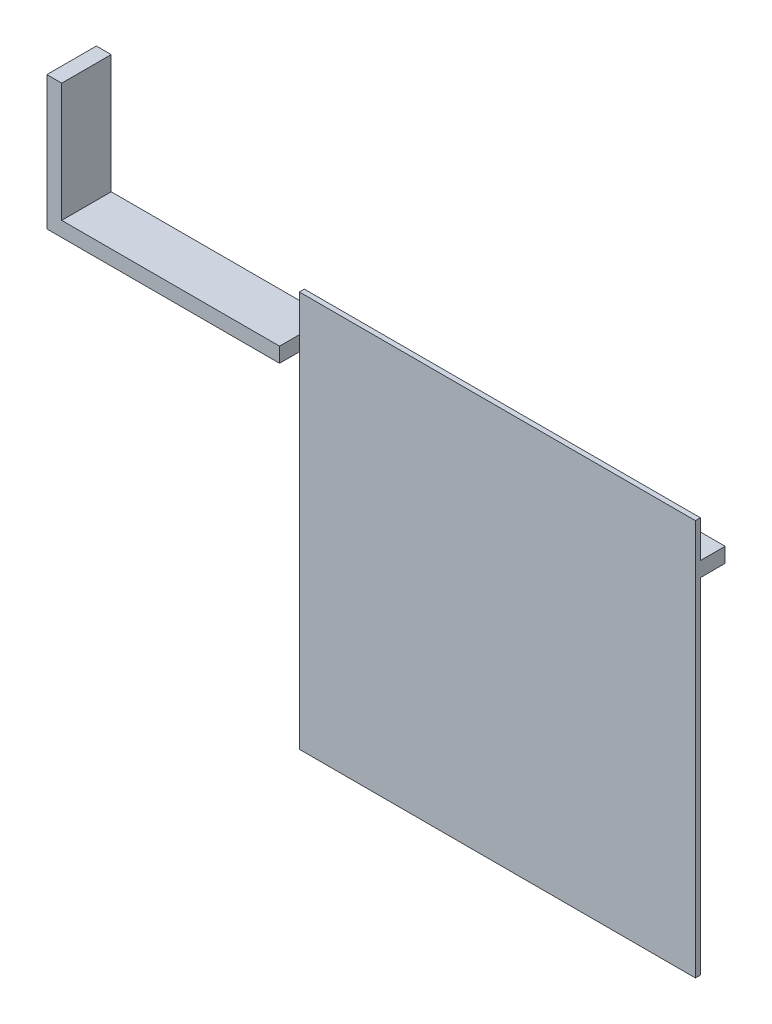
ISO-10303-21;
HEADER;
FILE_DESCRIPTION(('STEP AP214'),'2;1');
FILE_NAME('part.step','',(''),(''),'','','');
FILE_SCHEMA(('AUTOMOTIVE_DESIGN { 1 0 10303 214 1 1 1 1 }'));
ENDSEC;
DATA;
#1=APPLICATION_CONTEXT('core data for automotive mechanical design processes');
#2=APPLICATION_PROTOCOL_DEFINITION('international standard','automotive_design',2000,#1);
#3=PRODUCT_CONTEXT('',#1,'mechanical');
#4=PRODUCT('Part','Part','',(#3));
#5=PRODUCT_RELATED_PRODUCT_CATEGORY('part','',(#4));
#6=PRODUCT_DEFINITION_FORMATION('','',#4);
#7=PRODUCT_DEFINITION_CONTEXT('part definition',#1,'design');
#8=PRODUCT_DEFINITION('design','',#6,#7);
#9=PRODUCT_DEFINITION_SHAPE('','',#8);
#10=(LENGTH_UNIT() NAMED_UNIT(*) SI_UNIT(.MILLI.,.METRE.));
#11=(NAMED_UNIT(*) PLANE_ANGLE_UNIT() SI_UNIT($,.RADIAN.));
#12=(NAMED_UNIT(*) SI_UNIT($,.STERADIAN.) SOLID_ANGLE_UNIT());
#13=UNCERTAINTY_MEASURE_WITH_UNIT(LENGTH_MEASURE(1.E-05),#10,'distance_accuracy_value','');
#14=(GEOMETRIC_REPRESENTATION_CONTEXT(3) GLOBAL_UNCERTAINTY_ASSIGNED_CONTEXT((#13)) GLOBAL_UNIT_ASSIGNED_CONTEXT((#10,
#11,#12)) REPRESENTATION_CONTEXT('',''));
#15=CARTESIAN_POINT('',(0.,0.,0.));
#16=DIRECTION('',(0.,0.,1.));
#17=DIRECTION('',(1.,0.,0.));
#18=AXIS2_PLACEMENT_3D('',#15,#16,#17);
#19=CARTESIAN_POINT('',(47.,-30.,10.));
#20=DIRECTION('',(-1.,0.,0.));
#21=DIRECTION('',(0.,-1.,0.));
#22=AXIS2_PLACEMENT_3D('',#19,#20,#21);
#23=PLANE('',#22);
#24=DIRECTION('',(0.,-1.,0.));
#25=VECTOR('',#24,1.);
#26=CARTESIAN_POINT('',(47.,-30.,6.00000000000002));
#27=LINE('',#26,#25);
#28=CARTESIAN_POINT('',(47.,-24.,6.00000000000002));
#29=VERTEX_POINT('',#28);
#30=CARTESIAN_POINT('',(47.,-27.,6.00000000000002));
#31=VERTEX_POINT('',#30);
#32=EDGE_CURVE('E11',#29,#31,#27,.T.);
#33=ORIENTED_EDGE('',*,*,#32,.F.);
#34=DIRECTION('',(0.,0.,1.));
#35=VECTOR('',#34,1.);
#36=CARTESIAN_POINT('',(47.,-24.,10.));
#37=LINE('',#36,#35);
#38=CARTESIAN_POINT('',(47.,-24.,10.));
#39=VERTEX_POINT('',#38);
#40=EDGE_CURVE('E50',#29,#39,#37,.T.);
#41=ORIENTED_EDGE('',*,*,#40,.T.);
#42=DIRECTION('',(0.,-1.,0.));
#43=VECTOR('',#42,1.);
#44=CARTESIAN_POINT('',(47.,0.,10.));
#45=LINE('',#44,#43);
#46=CARTESIAN_POINT('',(47.,-27.,10.));
#47=VERTEX_POINT('',#46);
#48=EDGE_CURVE('E41',#39,#47,#45,.T.);
#49=ORIENTED_EDGE('',*,*,#48,.T.);
#50=DIRECTION('',(0.,0.,1.));
#51=VECTOR('',#50,1.);
#52=CARTESIAN_POINT('',(47.,-27.,10.));
#53=LINE('',#52,#51);
#54=EDGE_CURVE('E164',#31,#47,#53,.T.);
#55=ORIENTED_EDGE('',*,*,#54,.F.);
#56=EDGE_LOOP('',(#33,#41,#49,#55));
#57=FACE_BOUND('',#56,.T.);
#58=ADVANCED_FACE('F33',(#57),#23,.F.);
#59=CARTESIAN_POINT('',(3.,0.,10.));
#60=DIRECTION('',(0.,-1.,0.));
#61=DIRECTION('',(1.,0.,0.));
#62=AXIS2_PLACEMENT_3D('',#59,#60,#61);
#63=PLANE('',#62);
#64=DIRECTION('',(-1.,0.,0.));
#65=VECTOR('',#64,1.);
#66=CARTESIAN_POINT('',(3.,0.,0.));
#67=LINE('',#66,#65);
#68=CARTESIAN_POINT('',(3.,0.,0.));
#69=VERTEX_POINT('',#68);
#70=CARTESIAN_POINT('',(0.,0.,0.));
#71=VERTEX_POINT('',#70);
#72=EDGE_CURVE('E169',#69,#71,#67,.T.);
#73=ORIENTED_EDGE('',*,*,#72,.T.);
#74=DIRECTION('',(0.,0.,-1.));
#75=VECTOR('',#74,1.);
#76=CARTESIAN_POINT('',(0.,0.,10.));
#77=LINE('',#76,#75);
#78=CARTESIAN_POINT('',(0.,0.,10.));
#79=VERTEX_POINT('',#78);
#80=EDGE_CURVE('E209',#79,#71,#77,.T.);
#81=ORIENTED_EDGE('',*,*,#80,.F.);
#82=DIRECTION('',(-1.,0.,0.));
#83=VECTOR('',#82,1.);
#84=CARTESIAN_POINT('',(3.,0.,10.));
#85=LINE('',#84,#83);
#86=CARTESIAN_POINT('',(3.,0.,10.));
#87=VERTEX_POINT('',#86);
#88=EDGE_CURVE('E170',#87,#79,#85,.T.);
#89=ORIENTED_EDGE('',*,*,#88,.F.);
#90=DIRECTION('',(0.,0.,-1.));
#91=VECTOR('',#90,1.);
#92=CARTESIAN_POINT('',(3.,0.,10.));
#93=LINE('',#92,#91);
#94=EDGE_CURVE('E183',#87,#69,#93,.T.);
#95=ORIENTED_EDGE('',*,*,#94,.T.);
#96=EDGE_LOOP('',(#73,#81,#89,#95));
#97=FACE_BOUND('',#96,.T.);
#98=ADVANCED_FACE('F35',(#97),#63,.F.);
#99=CARTESIAN_POINT('',(0.,0.,10.));
#100=DIRECTION('',(1.,0.,0.));
#101=DIRECTION('',(0.,0.,-1.));
#102=AXIS2_PLACEMENT_3D('',#99,#100,#101);
#103=PLANE('',#102);
#104=DIRECTION('',(0.,-1.,0.));
#105=VECTOR('',#104,1.);
#106=CARTESIAN_POINT('',(0.,0.,0.));
#107=LINE('',#106,#105);
#108=CARTESIAN_POINT('',(0.,-27.,0.));
#109=VERTEX_POINT('',#108);
#110=EDGE_CURVE('E186',#71,#109,#107,.T.);
#111=ORIENTED_EDGE('',*,*,#110,.T.);
#112=DIRECTION('',(0.,0.,-1.));
#113=VECTOR('',#112,1.);
#114=CARTESIAN_POINT('',(0.,-27.,10.));
#115=LINE('',#114,#113);
#116=CARTESIAN_POINT('',(0.,-27.,10.));
#117=VERTEX_POINT('',#116);
#118=EDGE_CURVE('E206',#117,#109,#115,.T.);
#119=ORIENTED_EDGE('',*,*,#118,.F.);
#120=DIRECTION('',(0.,-1.,0.));
#121=VECTOR('',#120,1.);
#122=CARTESIAN_POINT('',(0.,0.,10.));
#123=LINE('',#122,#121);
#124=EDGE_CURVE('E173',#79,#117,#123,.T.);
#125=ORIENTED_EDGE('',*,*,#124,.F.);
#126=ORIENTED_EDGE('',*,*,#80,.T.);
#127=EDGE_LOOP('',(#111,#119,#125,#126));
#128=FACE_BOUND('',#127,.T.);
#129=ADVANCED_FACE('F282',(#128),#103,.F.);
#130=CARTESIAN_POINT('',(0.,-27.,10.));
#131=DIRECTION('',(0.,1.,0.));
#132=DIRECTION('',(0.,0.,1.));
#133=AXIS2_PLACEMENT_3D('',#130,#131,#132);
#134=PLANE('',#133);
#135=DIRECTION('',(-1.,0.,0.));
#136=VECTOR('',#135,1.);
#137=CARTESIAN_POINT('',(0.,-27.,5.00000000000002));
#138=LINE('',#137,#136);
#139=CARTESIAN_POINT('',(127.,-27.,5.));
#140=VERTEX_POINT('',#139);
#141=CARTESIAN_POINT('',(47.,-27.,5.00000000000001));
#142=VERTEX_POINT('',#141);
#143=EDGE_CURVE('E167',#140,#142,#138,.T.);
#144=ORIENTED_EDGE('',*,*,#143,.T.);
#145=EDGE_CURVE('E165',#142,#31,#53,.T.);
#146=ORIENTED_EDGE('',*,*,#145,.T.);
#147=ORIENTED_EDGE('',*,*,#54,.T.);
#148=DIRECTION('',(1.,0.,0.));
#149=VECTOR('',#148,1.);
#150=CARTESIAN_POINT('',(0.,-27.,10.));
#151=LINE('',#150,#149);
#152=EDGE_CURVE('E176',#117,#47,#151,.T.);
#153=ORIENTED_EDGE('',*,*,#152,.F.);
#154=ORIENTED_EDGE('',*,*,#118,.T.);
#155=DIRECTION('',(1.,0.,0.));
#156=VECTOR('',#155,1.);
#157=CARTESIAN_POINT('',(0.,-27.,0.));
#158=LINE('',#157,#156);
#159=CARTESIAN_POINT('',(127.,-27.,0.));
#160=VERTEX_POINT('',#159);
#161=EDGE_CURVE('E188',#109,#160,#158,.T.);
#162=ORIENTED_EDGE('',*,*,#161,.T.);
#163=DIRECTION('',(0.,0.,-1.));
#164=VECTOR('',#163,1.);
#165=CARTESIAN_POINT('',(127.,-27.,10.));
#166=LINE('',#165,#164);
#167=EDGE_CURVE('E204',#140,#160,#166,.T.);
#168=ORIENTED_EDGE('',*,*,#167,.F.);
#169=EDGE_LOOP('',(#144,#146,#147,#153,#154,#162,#168));
#170=FACE_BOUND('',#169,.T.);
#171=ADVANCED_FACE('F218',(#170),#134,.F.);
#172=CARTESIAN_POINT('',(127.,-27.,10.));
#173=DIRECTION('',(-1.,0.,0.));
#174=DIRECTION('',(0.,0.,1.));
#175=AXIS2_PLACEMENT_3D('',#172,#173,#174);
#176=PLANE('',#175);
#177=DIRECTION('',(0.,0.,-1.));
#178=VECTOR('',#177,1.);
#179=CARTESIAN_POINT('',(127.,-24.,10.));
#180=LINE('',#179,#178);
#181=CARTESIAN_POINT('',(127.,-24.,5.));
#182=VERTEX_POINT('',#181);
#183=CARTESIAN_POINT('',(127.,-24.,0.));
#184=VERTEX_POINT('',#183);
#185=EDGE_CURVE('E202',#182,#184,#180,.T.);
#186=ORIENTED_EDGE('',*,*,#185,.F.);
#187=DIRECTION('',(0.,1.,0.));
#188=VECTOR('',#187,1.);
#189=CARTESIAN_POINT('',(127.,-96.52,5.00000000000002));
#190=LINE('',#189,#188);
#191=CARTESIAN_POINT('',(127.,-16.52,5.00000000000002));
#192=VERTEX_POINT('',#191);
#193=EDGE_CURVE('E151',#182,#192,#190,.T.);
#194=ORIENTED_EDGE('',*,*,#193,.T.);
#195=DIRECTION('',(0.,0.,-1.));
#196=VECTOR('',#195,1.);
#197=CARTESIAN_POINT('',(127.,-16.52,6.00000000000002));
#198=LINE('',#197,#196);
#199=CARTESIAN_POINT('',(127.,-16.52,6.00000000000002));
#200=VERTEX_POINT('',#199);
#201=EDGE_CURVE('E130',#200,#192,#198,.T.);
#202=ORIENTED_EDGE('',*,*,#201,.F.);
#203=DIRECTION('',(0.,1.,0.));
#204=VECTOR('',#203,1.);
#205=CARTESIAN_POINT('',(127.,-96.52,6.00000000000002));
#206=LINE('',#205,#204);
#207=CARTESIAN_POINT('',(127.,-96.52,6.00000000000002));
#208=VERTEX_POINT('',#207);
#209=EDGE_CURVE('E137',#208,#200,#206,.T.);
#210=ORIENTED_EDGE('',*,*,#209,.F.);
#211=DIRECTION('',(0.,0.,-1.));
#212=VECTOR('',#211,1.);
#213=CARTESIAN_POINT('',(127.,-96.52,6.00000000000002));
#214=LINE('',#213,#212);
#215=CARTESIAN_POINT('',(127.,-96.52,5.00000000000002));
#216=VERTEX_POINT('',#215);
#217=EDGE_CURVE('E242',#208,#216,#214,.T.);
#218=ORIENTED_EDGE('',*,*,#217,.T.);
#219=EDGE_CURVE('E237',#216,#140,#190,.T.);
#220=ORIENTED_EDGE('',*,*,#219,.T.);
#221=ORIENTED_EDGE('',*,*,#167,.T.);
#222=DIRECTION('',(0.,1.,0.));
#223=VECTOR('',#222,1.);
#224=CARTESIAN_POINT('',(127.,-27.,0.));
#225=LINE('',#224,#223);
#226=EDGE_CURVE('E191',#160,#184,#225,.T.);
#227=ORIENTED_EDGE('',*,*,#226,.T.);
#228=EDGE_LOOP('',(#186,#194,#202,#210,#218,#220,#221,#227));
#229=FACE_BOUND('',#228,.T.);
#230=ADVANCED_FACE('F149',(#229),#176,.F.);
#231=CARTESIAN_POINT('',(127.,-24.,10.));
#232=DIRECTION('',(0.,-1.,0.));
#233=DIRECTION('',(1.,0.,0.));
#234=AXIS2_PLACEMENT_3D('',#231,#232,#233);
#235=PLANE('',#234);
#236=DIRECTION('',(-1.,0.,0.));
#237=VECTOR('',#236,1.);
#238=CARTESIAN_POINT('',(127.,-24.,10.));
#239=LINE('',#238,#237);
#240=CARTESIAN_POINT('',(3.,-24.,10.));
#241=VERTEX_POINT('',#240);
#242=EDGE_CURVE('E179',#39,#241,#239,.T.);
#243=ORIENTED_EDGE('',*,*,#242,.F.);
#244=ORIENTED_EDGE('',*,*,#40,.F.);
#245=CARTESIAN_POINT('',(47.,-24.,5.00000000000001));
#246=VERTEX_POINT('',#245);
#247=EDGE_CURVE('E161',#246,#29,#37,.T.);
#248=ORIENTED_EDGE('',*,*,#247,.F.);
#249=DIRECTION('',(-1.,0.,0.));
#250=VECTOR('',#249,1.);
#251=CARTESIAN_POINT('',(127.,-24.,5.));
#252=LINE('',#251,#250);
#253=EDGE_CURVE('E153',#182,#246,#252,.T.);
#254=ORIENTED_EDGE('',*,*,#253,.F.);
#255=ORIENTED_EDGE('',*,*,#185,.T.);
#256=DIRECTION('',(-1.,0.,0.));
#257=VECTOR('',#256,1.);
#258=CARTESIAN_POINT('',(127.,-24.,0.));
#259=LINE('',#258,#257);
#260=CARTESIAN_POINT('',(3.,-24.,0.));
#261=VERTEX_POINT('',#260);
#262=EDGE_CURVE('E194',#184,#261,#259,.T.);
#263=ORIENTED_EDGE('',*,*,#262,.T.);
#264=DIRECTION('',(0.,0.,-1.));
#265=VECTOR('',#264,1.);
#266=CARTESIAN_POINT('',(3.,-24.,10.));
#267=LINE('',#266,#265);
#268=EDGE_CURVE('E199',#241,#261,#267,.T.);
#269=ORIENTED_EDGE('',*,*,#268,.F.);
#270=EDGE_LOOP('',(#243,#244,#248,#254,#255,#263,#269));
#271=FACE_BOUND('',#270,.T.);
#272=ADVANCED_FACE('F256',(#271),#235,.F.);
#273=CARTESIAN_POINT('',(3.,-24.,10.));
#274=DIRECTION('',(-1.,0.,0.));
#275=DIRECTION('',(0.,-1.,0.));
#276=AXIS2_PLACEMENT_3D('',#273,#274,#275);
#277=PLANE('',#276);
#278=DIRECTION('',(0.,1.,0.));
#279=VECTOR('',#278,1.);
#280=CARTESIAN_POINT('',(3.,-24.,0.));
#281=LINE('',#280,#279);
#282=EDGE_CURVE('E174',#261,#69,#281,.T.);
#283=ORIENTED_EDGE('',*,*,#282,.T.);
#284=ORIENTED_EDGE('',*,*,#94,.F.);
#285=DIRECTION('',(0.,1.,0.));
#286=VECTOR('',#285,1.);
#287=CARTESIAN_POINT('',(3.,-24.,10.));
#288=LINE('',#287,#286);
#289=EDGE_CURVE('E181',#241,#87,#288,.T.);
#290=ORIENTED_EDGE('',*,*,#289,.F.);
#291=ORIENTED_EDGE('',*,*,#268,.T.);
#292=EDGE_LOOP('',(#283,#284,#290,#291));
#293=FACE_BOUND('',#292,.T.);
#294=ADVANCED_FACE('F259',(#293),#277,.F.);
#295=CARTESIAN_POINT('',(0.,0.,10.));
#296=DIRECTION('',(0.,0.,1.));
#297=DIRECTION('',(1.,0.,0.));
#298=AXIS2_PLACEMENT_3D('',#295,#296,#297);
#299=PLANE('',#298);
#300=ORIENTED_EDGE('',*,*,#48,.F.);
#301=ORIENTED_EDGE('',*,*,#242,.T.);
#302=ORIENTED_EDGE('',*,*,#289,.T.);
#303=ORIENTED_EDGE('',*,*,#88,.T.);
#304=ORIENTED_EDGE('',*,*,#124,.T.);
#305=ORIENTED_EDGE('',*,*,#152,.T.);
#306=EDGE_LOOP('',(#300,#301,#302,#303,#304,#305));
#307=FACE_BOUND('',#306,.T.);
#308=ADVANCED_FACE('F215',(#307),#299,.T.);
#309=CARTESIAN_POINT('',(0.,0.,0.));
#310=DIRECTION('',(0.,0.,1.));
#311=DIRECTION('',(1.,0.,0.));
#312=AXIS2_PLACEMENT_3D('',#309,#310,#311);
#313=PLANE('',#312);
#314=ORIENTED_EDGE('',*,*,#72,.F.);
#315=ORIENTED_EDGE('',*,*,#282,.F.);
#316=ORIENTED_EDGE('',*,*,#262,.F.);
#317=ORIENTED_EDGE('',*,*,#226,.F.);
#318=ORIENTED_EDGE('',*,*,#161,.F.);
#319=ORIENTED_EDGE('',*,*,#110,.F.);
#320=EDGE_LOOP('',(#314,#315,#316,#317,#318,#319));
#321=FACE_BOUND('',#320,.T.);
#322=ADVANCED_FACE('F252',(#321),#313,.F.);
#323=CARTESIAN_POINT('',(47.,-96.52,6.00000000000002));
#324=DIRECTION('',(1.,0.,0.));
#325=DIRECTION('',(0.,0.,-1.));
#326=AXIS2_PLACEMENT_3D('',#323,#324,#325);
#327=PLANE('',#326);
#328=DIRECTION('',(0.,-1.,0.));
#329=VECTOR('',#328,1.);
#330=CARTESIAN_POINT('',(47.,-96.52,6.00000000000002));
#331=LINE('',#330,#329);
#332=CARTESIAN_POINT('',(47.,-96.52,6.00000000000002));
#333=VERTEX_POINT('',#332);
#334=EDGE_CURVE('E136',#31,#333,#331,.T.);
#335=ORIENTED_EDGE('',*,*,#334,.F.);
#336=ORIENTED_EDGE('',*,*,#145,.F.);
#337=DIRECTION('',(0.,-1.,0.));
#338=VECTOR('',#337,1.);
#339=CARTESIAN_POINT('',(47.,-96.52,5.00000000000002));
#340=LINE('',#339,#338);
#341=CARTESIAN_POINT('',(47.,-96.52,5.00000000000002));
#342=VERTEX_POINT('',#341);
#343=EDGE_CURVE('E226',#142,#342,#340,.T.);
#344=ORIENTED_EDGE('',*,*,#343,.T.);
#345=DIRECTION('',(0.,0.,-1.));
#346=VECTOR('',#345,1.);
#347=CARTESIAN_POINT('',(47.,-96.52,6.00000000000002));
#348=LINE('',#347,#346);
#349=EDGE_CURVE('E157',#333,#342,#348,.T.);
#350=ORIENTED_EDGE('',*,*,#349,.F.);
#351=EDGE_LOOP('',(#335,#336,#344,#350));
#352=FACE_BOUND('',#351,.T.);
#353=ADVANCED_FACE('F224',(#352),#327,.F.);
#354=CARTESIAN_POINT('',(47.,-16.52,5.00000000000002));
#355=VERTEX_POINT('',#354);
#356=EDGE_CURVE('E233',#355,#246,#340,.T.);
#357=ORIENTED_EDGE('',*,*,#356,.T.);
#358=ORIENTED_EDGE('',*,*,#247,.T.);
#359=CARTESIAN_POINT('',(47.,-16.52,6.00000000000002));
#360=VERTEX_POINT('',#359);
#361=EDGE_CURVE('E245',#360,#29,#331,.T.);
#362=ORIENTED_EDGE('',*,*,#361,.F.);
#363=DIRECTION('',(0.,0.,-1.));
#364=VECTOR('',#363,1.);
#365=CARTESIAN_POINT('',(47.,-16.52,6.00000000000002));
#366=LINE('',#365,#364);
#367=EDGE_CURVE('E132',#360,#355,#366,.T.);
#368=ORIENTED_EDGE('',*,*,#367,.T.);
#369=EDGE_LOOP('',(#357,#358,#362,#368));
#370=FACE_BOUND('',#369,.T.);
#371=ADVANCED_FACE('F264',(#370),#327,.F.);
#372=CARTESIAN_POINT('',(0.,0.,5.00000000000002));
#373=DIRECTION('',(0.,0.,-1.));
#374=DIRECTION('',(-1.,0.,0.));
#375=AXIS2_PLACEMENT_3D('',#372,#373,#374);
#376=PLANE('',#375);
#377=ORIENTED_EDGE('',*,*,#143,.F.);
#378=ORIENTED_EDGE('',*,*,#219,.F.);
#379=DIRECTION('',(1.,0.,0.));
#380=VECTOR('',#379,1.);
#381=CARTESIAN_POINT('',(47.,-96.52,5.00000000000002));
#382=LINE('',#381,#380);
#383=EDGE_CURVE('E146',#342,#216,#382,.T.);
#384=ORIENTED_EDGE('',*,*,#383,.F.);
#385=ORIENTED_EDGE('',*,*,#343,.F.);
#386=EDGE_LOOP('',(#377,#378,#384,#385));
#387=FACE_BOUND('',#386,.T.);
#388=ADVANCED_FACE('F230',(#387),#376,.T.);
#389=ORIENTED_EDGE('',*,*,#253,.T.);
#390=ORIENTED_EDGE('',*,*,#356,.F.);
#391=DIRECTION('',(-1.,0.,0.));
#392=VECTOR('',#391,1.);
#393=CARTESIAN_POINT('',(47.,-16.52,5.00000000000002));
#394=LINE('',#393,#392);
#395=EDGE_CURVE('E234',#192,#355,#394,.T.);
#396=ORIENTED_EDGE('',*,*,#395,.F.);
#397=ORIENTED_EDGE('',*,*,#193,.F.);
#398=EDGE_LOOP('',(#389,#390,#396,#397));
#399=FACE_BOUND('',#398,.T.);
#400=ADVANCED_FACE('F267',(#399),#376,.T.);
#401=CARTESIAN_POINT('',(47.,-16.52,6.00000000000002));
#402=DIRECTION('',(0.,-1.,0.));
#403=DIRECTION('',(0.,0.,-1.));
#404=AXIS2_PLACEMENT_3D('',#401,#402,#403);
#405=PLANE('',#404);
#406=ORIENTED_EDGE('',*,*,#395,.T.);
#407=ORIENTED_EDGE('',*,*,#367,.F.);
#408=DIRECTION('',(-1.,0.,0.));
#409=VECTOR('',#408,1.);
#410=CARTESIAN_POINT('',(47.,-16.52,6.00000000000002));
#411=LINE('',#410,#409);
#412=EDGE_CURVE('E126',#200,#360,#411,.T.);
#413=ORIENTED_EDGE('',*,*,#412,.F.);
#414=ORIENTED_EDGE('',*,*,#201,.T.);
#415=EDGE_LOOP('',(#406,#407,#413,#414));
#416=FACE_BOUND('',#415,.T.);
#417=ADVANCED_FACE('F128',(#416),#405,.F.);
#418=CARTESIAN_POINT('',(47.,-96.52,6.00000000000002));
#419=DIRECTION('',(0.,1.,0.));
#420=DIRECTION('',(0.,0.,1.));
#421=AXIS2_PLACEMENT_3D('',#418,#419,#420);
#422=PLANE('',#421);
#423=ORIENTED_EDGE('',*,*,#383,.T.);
#424=ORIENTED_EDGE('',*,*,#217,.F.);
#425=DIRECTION('',(1.,0.,0.));
#426=VECTOR('',#425,1.);
#427=CARTESIAN_POINT('',(47.,-96.52,6.00000000000002));
#428=LINE('',#427,#426);
#429=EDGE_CURVE('E142',#333,#208,#428,.T.);
#430=ORIENTED_EDGE('',*,*,#429,.F.);
#431=ORIENTED_EDGE('',*,*,#349,.T.);
#432=EDGE_LOOP('',(#423,#424,#430,#431));
#433=FACE_BOUND('',#432,.T.);
#434=ADVANCED_FACE('F244',(#433),#422,.F.);
#435=CARTESIAN_POINT('',(0.,0.,6.00000000000002));
#436=DIRECTION('',(0.,0.,-1.));
#437=DIRECTION('',(-1.,0.,0.));
#438=AXIS2_PLACEMENT_3D('',#435,#436,#437);
#439=PLANE('',#438);
#440=ORIENTED_EDGE('',*,*,#209,.T.);
#441=ORIENTED_EDGE('',*,*,#412,.T.);
#442=ORIENTED_EDGE('',*,*,#361,.T.);
#443=ORIENTED_EDGE('',*,*,#32,.T.);
#444=ORIENTED_EDGE('',*,*,#334,.T.);
#445=ORIENTED_EDGE('',*,*,#429,.T.);
#446=EDGE_LOOP('',(#440,#441,#442,#443,#444,#445));
#447=FACE_BOUND('',#446,.T.);
#448=ADVANCED_FACE('F140',(#447),#439,.F.);
#449=CLOSED_SHELL('',(#58,#98,#129,#171,#230,#272,#294,#308,#322,#353,#371,#388,#400,#417,#434,#448));
#450=MANIFOLD_SOLID_BREP('B2',#449);
#451=ADVANCED_BREP_SHAPE_REPRESENTATION('',(#18,#450),#14);
#452=SHAPE_DEFINITION_REPRESENTATION(#9,#451);
ENDSEC;
END-ISO-10303-21;
